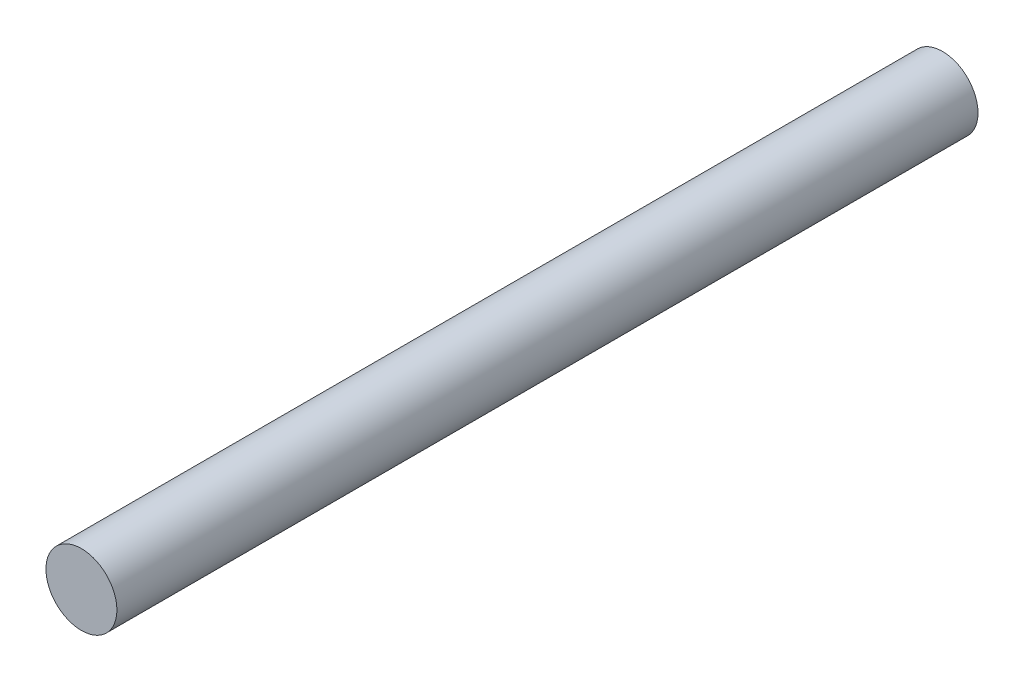
ISO-10303-21;
HEADER;
FILE_DESCRIPTION(('STEP AP214'),'2;1');
FILE_NAME('part.step','',(''),(''),'','','');
FILE_SCHEMA(('AUTOMOTIVE_DESIGN { 1 0 10303 214 1 1 1 1 }'));
ENDSEC;
DATA;
#1=APPLICATION_CONTEXT('core data for automotive mechanical design processes');
#2=APPLICATION_PROTOCOL_DEFINITION('international standard','automotive_design',2000,#1);
#3=PRODUCT_CONTEXT('',#1,'mechanical');
#4=PRODUCT('Part','Part','',(#3));
#5=PRODUCT_RELATED_PRODUCT_CATEGORY('part','',(#4));
#6=PRODUCT_DEFINITION_FORMATION('','',#4);
#7=PRODUCT_DEFINITION_CONTEXT('part definition',#1,'design');
#8=PRODUCT_DEFINITION('design','',#6,#7);
#9=PRODUCT_DEFINITION_SHAPE('','',#8);
#10=(LENGTH_UNIT() NAMED_UNIT(*) SI_UNIT(.MILLI.,.METRE.));
#11=(NAMED_UNIT(*) PLANE_ANGLE_UNIT() SI_UNIT($,.RADIAN.));
#12=(NAMED_UNIT(*) SI_UNIT($,.STERADIAN.) SOLID_ANGLE_UNIT());
#13=UNCERTAINTY_MEASURE_WITH_UNIT(LENGTH_MEASURE(1.E-05),#10,'distance_accuracy_value','');
#14=(GEOMETRIC_REPRESENTATION_CONTEXT(3) GLOBAL_UNCERTAINTY_ASSIGNED_CONTEXT((#13)) GLOBAL_UNIT_ASSIGNED_CONTEXT((#10,
#11,#12)) REPRESENTATION_CONTEXT('',''));
#15=CARTESIAN_POINT('',(0.,0.,0.));
#16=DIRECTION('',(0.,0.,1.));
#17=DIRECTION('',(1.,0.,0.));
#18=AXIS2_PLACEMENT_3D('',#15,#16,#17);
#19=CARTESIAN_POINT('',(0.,0.,18.2));
#20=DIRECTION('',(0.,0.,-1.));
#21=DIRECTION('',(-1.,0.,0.));
#22=AXIS2_PLACEMENT_3D('',#19,#20,#21);
#23=CYLINDRICAL_SURFACE('',#22,0.75);
#24=CARTESIAN_POINT('',(0.,0.,18.2));
#25=DIRECTION('',(0.,0.,1.));
#26=DIRECTION('',(1.,0.,0.));
#27=AXIS2_PLACEMENT_3D('',#24,#25,#26);
#28=CIRCLE('',#27,0.75);
#29=CARTESIAN_POINT('',(0.75,0.,18.2));
#30=VERTEX_POINT('',#29);
#31=EDGE_CURVE('E10',#30,#30,#28,.T.);
#32=ORIENTED_EDGE('',*,*,#31,.F.);
#33=EDGE_LOOP('',(#32));
#34=FACE_BOUND('',#33,.T.);
#35=CARTESIAN_POINT('',(0.,0.,0.));
#36=DIRECTION('',(0.,0.,1.));
#37=DIRECTION('',(1.,0.,0.));
#38=AXIS2_PLACEMENT_3D('',#35,#36,#37);
#39=CIRCLE('',#38,0.75);
#40=CARTESIAN_POINT('',(0.75,0.,0.));
#41=VERTEX_POINT('',#40);
#42=EDGE_CURVE('E42',#41,#41,#39,.T.);
#43=ORIENTED_EDGE('',*,*,#42,.T.);
#44=EDGE_LOOP('',(#43));
#45=FACE_BOUND('',#44,.T.);
#46=ADVANCED_FACE('F39',(#34,#45),#23,.T.);
#47=CARTESIAN_POINT('',(0.,0.,18.2));
#48=DIRECTION('',(0.,0.,1.));
#49=DIRECTION('',(1.,0.,0.));
#50=AXIS2_PLACEMENT_3D('',#47,#48,#49);
#51=PLANE('',#50);
#52=ORIENTED_EDGE('',*,*,#31,.T.);
#53=EDGE_LOOP('',(#52));
#54=FACE_BOUND('',#53,.T.);
#55=ADVANCED_FACE('F54',(#54),#51,.T.);
#56=CARTESIAN_POINT('',(0.,0.,0.));
#57=DIRECTION('',(0.,0.,1.));
#58=DIRECTION('',(1.,0.,0.));
#59=AXIS2_PLACEMENT_3D('',#56,#57,#58);
#60=PLANE('',#59);
#61=ORIENTED_EDGE('',*,*,#42,.F.);
#62=EDGE_LOOP('',(#61));
#63=FACE_BOUND('',#62,.T.);
#64=ADVANCED_FACE('F52',(#63),#60,.F.);
#65=CLOSED_SHELL('',(#46,#55,#64));
#66=MANIFOLD_SOLID_BREP('B2',#65);
#67=ADVANCED_BREP_SHAPE_REPRESENTATION('',(#18,#66),#14);
#68=SHAPE_DEFINITION_REPRESENTATION(#9,#67);
ENDSEC;
END-ISO-10303-21;
